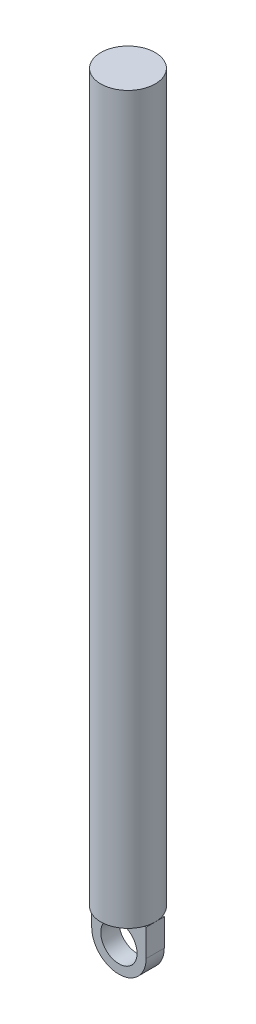
ISO-10303-21;
HEADER;
FILE_DESCRIPTION(('STEP AP214'),'2;1');
FILE_NAME('part.step','',(''),(''),'','','');
FILE_SCHEMA(('AUTOMOTIVE_DESIGN { 1 0 10303 214 1 1 1 1 }'));
ENDSEC;
DATA;
#1=APPLICATION_CONTEXT('core data for automotive mechanical design processes');
#2=APPLICATION_PROTOCOL_DEFINITION('international standard','automotive_design',2000,#1);
#3=PRODUCT_CONTEXT('',#1,'mechanical');
#4=PRODUCT('Part','Part','',(#3));
#5=PRODUCT_RELATED_PRODUCT_CATEGORY('part','',(#4));
#6=PRODUCT_DEFINITION_FORMATION('','',#4);
#7=PRODUCT_DEFINITION_CONTEXT('part definition',#1,'design');
#8=PRODUCT_DEFINITION('design','',#6,#7);
#9=PRODUCT_DEFINITION_SHAPE('','',#8);
#10=(LENGTH_UNIT() NAMED_UNIT(*) SI_UNIT(.MILLI.,.METRE.));
#11=(NAMED_UNIT(*) PLANE_ANGLE_UNIT() SI_UNIT($,.RADIAN.));
#12=(NAMED_UNIT(*) SI_UNIT($,.STERADIAN.) SOLID_ANGLE_UNIT());
#13=UNCERTAINTY_MEASURE_WITH_UNIT(LENGTH_MEASURE(1.E-05),#10,'distance_accuracy_value','');
#14=(GEOMETRIC_REPRESENTATION_CONTEXT(3) GLOBAL_UNCERTAINTY_ASSIGNED_CONTEXT((#13)) GLOBAL_UNIT_ASSIGNED_CONTEXT((#10,
#11,#12)) REPRESENTATION_CONTEXT('',''));
#15=CARTESIAN_POINT('',(0.,0.,0.));
#16=DIRECTION('',(0.,0.,1.));
#17=DIRECTION('',(1.,0.,0.));
#18=AXIS2_PLACEMENT_3D('',#15,#16,#17);
#19=CARTESIAN_POINT('',(0.,0.,0.));
#20=DIRECTION('',(0.,1.,0.));
#21=DIRECTION('',(0.,0.,1.));
#22=AXIS2_PLACEMENT_3D('',#19,#20,#21);
#23=PLANE('',#22);
#24=DIRECTION('',(1.,0.,0.));
#25=VECTOR('',#24,1.);
#26=CARTESIAN_POINT('',(0.,0.,-0.25));
#27=LINE('',#26,#25);
#28=CARTESIAN_POINT('',(0.792893218813452,0.,-0.25));
#29=VERTEX_POINT('',#28);
#30=CARTESIAN_POINT('',(2.20710678118655,0.,-0.25));
#31=VERTEX_POINT('',#30);
#32=EDGE_CURVE('E44',#29,#31,#27,.T.);
#33=ORIENTED_EDGE('',*,*,#32,.F.);
#34=CARTESIAN_POINT('',(1.5,0.,0.));
#35=DIRECTION('',(0.,1.,0.));
#36=DIRECTION('',(0.,0.,1.));
#37=AXIS2_PLACEMENT_3D('',#34,#35,#36);
#38=CIRCLE('',#37,0.75);
#39=EDGE_CURVE('E159',#31,#29,#38,.T.);
#40=ORIENTED_EDGE('',*,*,#39,.F.);
#41=EDGE_LOOP('',(#33,#40));
#42=FACE_BOUND('',#41,.T.);
#43=ADVANCED_FACE('F35',(#42),#23,.F.);
#44=CARTESIAN_POINT('',(0.792893218813452,0.,0.25));
#45=VERTEX_POINT('',#44);
#46=CARTESIAN_POINT('',(2.20710678118655,0.,0.25));
#47=VERTEX_POINT('',#46);
#48=EDGE_CURVE('E52',#45,#47,#38,.T.);
#49=ORIENTED_EDGE('',*,*,#48,.F.);
#50=DIRECTION('',(1.,0.,0.));
#51=VECTOR('',#50,1.);
#52=CARTESIAN_POINT('',(0.,0.,0.25));
#53=LINE('',#52,#51);
#54=EDGE_CURVE('E11',#45,#47,#53,.T.);
#55=ORIENTED_EDGE('',*,*,#54,.T.);
#56=EDGE_LOOP('',(#49,#55));
#57=FACE_BOUND('',#56,.T.);
#58=ADVANCED_FACE('F37',(#57),#23,.F.);
#59=CARTESIAN_POINT('',(1.5,20.,0.));
#60=DIRECTION('',(0.,1.,0.));
#61=DIRECTION('',(0.,0.,1.));
#62=AXIS2_PLACEMENT_3D('',#59,#60,#61);
#63=CYLINDRICAL_SURFACE('',#62,0.75);
#64=CARTESIAN_POINT('',(1.5,20.,0.));
#65=DIRECTION('',(0.,1.,0.));
#66=DIRECTION('',(0.,0.,1.));
#67=AXIS2_PLACEMENT_3D('',#64,#65,#66);
#68=CIRCLE('',#67,0.75);
#69=CARTESIAN_POINT('',(1.5,20.,0.75));
#70=VERTEX_POINT('',#69);
#71=EDGE_CURVE('E145',#70,#70,#68,.T.);
#72=ORIENTED_EDGE('',*,*,#71,.F.);
#73=EDGE_LOOP('',(#72));
#74=FACE_BOUND('',#73,.T.);
#75=CARTESIAN_POINT('',(2.25,0.,0.));
#76=VERTEX_POINT('',#75);
#77=EDGE_CURVE('E39',#47,#76,#38,.T.);
#78=ORIENTED_EDGE('',*,*,#77,.T.);
#79=EDGE_CURVE('E156',#76,#31,#38,.T.);
#80=ORIENTED_EDGE('',*,*,#79,.T.);
#81=ORIENTED_EDGE('',*,*,#39,.T.);
#82=CARTESIAN_POINT('',(0.75,0.,0.));
#83=VERTEX_POINT('',#82);
#84=EDGE_CURVE('E59',#29,#83,#38,.T.);
#85=ORIENTED_EDGE('',*,*,#84,.T.);
#86=EDGE_CURVE('E154',#83,#45,#38,.T.);
#87=ORIENTED_EDGE('',*,*,#86,.T.);
#88=ORIENTED_EDGE('',*,*,#48,.T.);
#89=EDGE_LOOP('',(#78,#80,#81,#85,#87,#88));
#90=FACE_BOUND('',#89,.T.);
#91=ADVANCED_FACE('F161',(#74,#90),#63,.T.);
#92=CARTESIAN_POINT('',(0.,20.,0.));
#93=DIRECTION('',(0.,1.,0.));
#94=DIRECTION('',(0.,0.,1.));
#95=AXIS2_PLACEMENT_3D('',#92,#93,#94);
#96=PLANE('',#95);
#97=ORIENTED_EDGE('',*,*,#71,.T.);
#98=EDGE_LOOP('',(#97));
#99=FACE_BOUND('',#98,.T.);
#100=ADVANCED_FACE('F187',(#99),#96,.T.);
#101=CARTESIAN_POINT('',(0.,0.,-0.25));
#102=DIRECTION('',(0.,-1.,0.));
#103=DIRECTION('',(0.,0.,-1.));
#104=AXIS2_PLACEMENT_3D('',#101,#102,#103);
#105=PLANE('',#104);
#106=ORIENTED_EDGE('',*,*,#77,.F.);
#107=CARTESIAN_POINT('',(2.25,0.,0.25));
#108=VERTEX_POINT('',#107);
#109=EDGE_CURVE('E47',#47,#108,#53,.T.);
#110=ORIENTED_EDGE('',*,*,#109,.T.);
#111=DIRECTION('',(0.,0.,1.));
#112=VECTOR('',#111,1.);
#113=CARTESIAN_POINT('',(2.25,0.,-0.25));
#114=LINE('',#113,#112);
#115=EDGE_CURVE('E150',#76,#108,#114,.T.);
#116=ORIENTED_EDGE('',*,*,#115,.F.);
#117=EDGE_LOOP('',(#106,#110,#116));
#118=FACE_BOUND('',#117,.T.);
#119=ADVANCED_FACE('F177',(#118),#105,.F.);
#120=ORIENTED_EDGE('',*,*,#79,.F.);
#121=CARTESIAN_POINT('',(2.25,0.,-0.25));
#122=VERTEX_POINT('',#121);
#123=EDGE_CURVE('E147',#122,#76,#114,.T.);
#124=ORIENTED_EDGE('',*,*,#123,.F.);
#125=EDGE_CURVE('E139',#31,#122,#27,.T.);
#126=ORIENTED_EDGE('',*,*,#125,.F.);
#127=EDGE_LOOP('',(#120,#124,#126));
#128=FACE_BOUND('',#127,.T.);
#129=ADVANCED_FACE('F179',(#128),#105,.F.);
#130=ORIENTED_EDGE('',*,*,#84,.F.);
#131=CARTESIAN_POINT('',(0.75,0.,-0.25));
#132=VERTEX_POINT('',#131);
#133=EDGE_CURVE('E111',#132,#29,#27,.T.);
#134=ORIENTED_EDGE('',*,*,#133,.F.);
#135=DIRECTION('',(0.,0.,1.));
#136=VECTOR('',#135,1.);
#137=CARTESIAN_POINT('',(0.75,0.,-0.25));
#138=LINE('',#137,#136);
#139=EDGE_CURVE('E142',#132,#83,#138,.T.);
#140=ORIENTED_EDGE('',*,*,#139,.T.);
#141=EDGE_LOOP('',(#130,#134,#140));
#142=FACE_BOUND('',#141,.T.);
#143=ADVANCED_FACE('F166',(#142),#105,.F.);
#144=CARTESIAN_POINT('',(0.75,0.,-0.25));
#145=DIRECTION('',(-1.,0.,0.));
#146=DIRECTION('',(0.,0.,1.));
#147=AXIS2_PLACEMENT_3D('',#144,#145,#146);
#148=PLANE('',#147);
#149=DIRECTION('',(0.,0.,1.));
#150=VECTOR('',#149,1.);
#151=CARTESIAN_POINT('',(0.75,-0.75,-0.25));
#152=LINE('',#151,#150);
#153=CARTESIAN_POINT('',(0.75,-0.75,-0.25));
#154=VERTEX_POINT('',#153);
#155=CARTESIAN_POINT('',(0.75,-0.75,0.25));
#156=VERTEX_POINT('',#155);
#157=EDGE_CURVE('E98',#154,#156,#152,.T.);
#158=ORIENTED_EDGE('',*,*,#157,.T.);
#159=DIRECTION('',(0.,-1.,0.));
#160=VECTOR('',#159,1.);
#161=CARTESIAN_POINT('',(0.75,0.,0.25));
#162=LINE('',#161,#160);
#163=CARTESIAN_POINT('',(0.75,0.,0.25));
#164=VERTEX_POINT('',#163);
#165=EDGE_CURVE('E103',#164,#156,#162,.T.);
#166=ORIENTED_EDGE('',*,*,#165,.F.);
#167=EDGE_CURVE('E146',#83,#164,#138,.T.);
#168=ORIENTED_EDGE('',*,*,#167,.F.);
#169=ORIENTED_EDGE('',*,*,#139,.F.);
#170=DIRECTION('',(0.,-1.,0.));
#171=VECTOR('',#170,1.);
#172=CARTESIAN_POINT('',(0.75,0.,-0.25));
#173=LINE('',#172,#171);
#174=EDGE_CURVE('E106',#132,#154,#173,.T.);
#175=ORIENTED_EDGE('',*,*,#174,.T.);
#176=EDGE_LOOP('',(#158,#166,#168,#169,#175));
#177=FACE_BOUND('',#176,.T.);
#178=ADVANCED_FACE('F100',(#177),#148,.T.);
#179=ORIENTED_EDGE('',*,*,#86,.F.);
#180=ORIENTED_EDGE('',*,*,#167,.T.);
#181=EDGE_CURVE('E46',#164,#45,#53,.T.);
#182=ORIENTED_EDGE('',*,*,#181,.T.);
#183=EDGE_LOOP('',(#179,#180,#182));
#184=FACE_BOUND('',#183,.T.);
#185=ADVANCED_FACE('F186',(#184),#105,.F.);
#186=CARTESIAN_POINT('',(2.25,0.,-0.25));
#187=DIRECTION('',(-1.,0.,0.));
#188=DIRECTION('',(0.,0.,1.));
#189=AXIS2_PLACEMENT_3D('',#186,#187,#188);
#190=PLANE('',#189);
#191=ORIENTED_EDGE('',*,*,#123,.T.);
#192=ORIENTED_EDGE('',*,*,#115,.T.);
#193=DIRECTION('',(0.,-1.,0.));
#194=VECTOR('',#193,1.);
#195=CARTESIAN_POINT('',(2.25,0.,0.25));
#196=LINE('',#195,#194);
#197=CARTESIAN_POINT('',(2.25,-0.75,0.25));
#198=VERTEX_POINT('',#197);
#199=EDGE_CURVE('E120',#108,#198,#196,.T.);
#200=ORIENTED_EDGE('',*,*,#199,.T.);
#201=DIRECTION('',(0.,0.,1.));
#202=VECTOR('',#201,1.);
#203=CARTESIAN_POINT('',(2.25,-0.75,-0.25));
#204=LINE('',#203,#202);
#205=CARTESIAN_POINT('',(2.25,-0.75,-0.25));
#206=VERTEX_POINT('',#205);
#207=EDGE_CURVE('E110',#206,#198,#204,.T.);
#208=ORIENTED_EDGE('',*,*,#207,.F.);
#209=DIRECTION('',(0.,-1.,0.));
#210=VECTOR('',#209,1.);
#211=CARTESIAN_POINT('',(2.25,0.,-0.25));
#212=LINE('',#211,#210);
#213=EDGE_CURVE('E137',#122,#206,#212,.T.);
#214=ORIENTED_EDGE('',*,*,#213,.F.);
#215=EDGE_LOOP('',(#191,#192,#200,#208,#214));
#216=FACE_BOUND('',#215,.T.);
#217=ADVANCED_FACE('F172',(#216),#190,.F.);
#218=CARTESIAN_POINT('',(1.5,-0.75,-0.25));
#219=DIRECTION('',(0.,0.,1.));
#220=DIRECTION('',(1.,0.,0.));
#221=AXIS2_PLACEMENT_3D('',#218,#219,#220);
#222=CYLINDRICAL_SURFACE('',#221,0.5);
#223=CARTESIAN_POINT('',(1.5,-0.75,-0.25));
#224=DIRECTION('',(0.,0.,1.));
#225=DIRECTION('',(1.,0.,0.));
#226=AXIS2_PLACEMENT_3D('',#223,#224,#225);
#227=CIRCLE('',#226,0.5);
#228=CARTESIAN_POINT('',(2.,-0.75,-0.25));
#229=VERTEX_POINT('',#228);
#230=EDGE_CURVE('E131',#229,#229,#227,.T.);
#231=ORIENTED_EDGE('',*,*,#230,.F.);
#232=EDGE_LOOP('',(#231));
#233=FACE_BOUND('',#232,.T.);
#234=CARTESIAN_POINT('',(1.5,-0.75,0.25));
#235=DIRECTION('',(0.,0.,1.));
#236=DIRECTION('',(1.,0.,0.));
#237=AXIS2_PLACEMENT_3D('',#234,#235,#236);
#238=CIRCLE('',#237,0.5);
#239=CARTESIAN_POINT('',(2.,-0.75,0.25));
#240=VERTEX_POINT('',#239);
#241=EDGE_CURVE('E125',#240,#240,#238,.T.);
#242=ORIENTED_EDGE('',*,*,#241,.T.);
#243=EDGE_LOOP('',(#242));
#244=FACE_BOUND('',#243,.T.);
#245=ADVANCED_FACE('F203',(#233,#244),#222,.F.);
#246=CARTESIAN_POINT('',(1.5,-0.75,-0.25));
#247=DIRECTION('',(0.,0.,1.));
#248=DIRECTION('',(1.,0.,0.));
#249=AXIS2_PLACEMENT_3D('',#246,#247,#248);
#250=CYLINDRICAL_SURFACE('',#249,0.75);
#251=ORIENTED_EDGE('',*,*,#207,.T.);
#252=CARTESIAN_POINT('',(1.5,-0.75,0.25));
#253=DIRECTION('',(0.,0.,1.));
#254=DIRECTION('',(1.,0.,0.));
#255=AXIS2_PLACEMENT_3D('',#252,#253,#254);
#256=CIRCLE('',#255,0.75);
#257=EDGE_CURVE('E114',#156,#198,#256,.T.);
#258=ORIENTED_EDGE('',*,*,#257,.F.);
#259=ORIENTED_EDGE('',*,*,#157,.F.);
#260=CARTESIAN_POINT('',(1.5,-0.75,-0.25));
#261=DIRECTION('',(0.,0.,1.));
#262=DIRECTION('',(1.,0.,0.));
#263=AXIS2_PLACEMENT_3D('',#260,#261,#262);
#264=CIRCLE('',#263,0.75);
#265=EDGE_CURVE('E135',#154,#206,#264,.T.);
#266=ORIENTED_EDGE('',*,*,#265,.T.);
#267=EDGE_LOOP('',(#251,#258,#259,#266));
#268=FACE_BOUND('',#267,.T.);
#269=ADVANCED_FACE('F115',(#268),#250,.T.);
#270=CARTESIAN_POINT('',(0.,0.,-0.25));
#271=DIRECTION('',(0.,0.,1.));
#272=DIRECTION('',(1.,0.,0.));
#273=AXIS2_PLACEMENT_3D('',#270,#271,#272);
#274=PLANE('',#273);
#275=ORIENTED_EDGE('',*,*,#230,.T.);
#276=EDGE_LOOP('',(#275));
#277=FACE_BOUND('',#276,.T.);
#278=ORIENTED_EDGE('',*,*,#174,.F.);
#279=ORIENTED_EDGE('',*,*,#133,.T.);
#280=ORIENTED_EDGE('',*,*,#32,.T.);
#281=ORIENTED_EDGE('',*,*,#125,.T.);
#282=ORIENTED_EDGE('',*,*,#213,.T.);
#283=ORIENTED_EDGE('',*,*,#265,.F.);
#284=EDGE_LOOP('',(#278,#279,#280,#281,#282,#283));
#285=FACE_BOUND('',#284,.T.);
#286=ADVANCED_FACE('F168',(#277,#285),#274,.F.);
#287=CARTESIAN_POINT('',(0.,0.,0.25));
#288=DIRECTION('',(0.,0.,1.));
#289=DIRECTION('',(1.,0.,0.));
#290=AXIS2_PLACEMENT_3D('',#287,#288,#289);
#291=PLANE('',#290);
#292=ORIENTED_EDGE('',*,*,#241,.F.);
#293=EDGE_LOOP('',(#292));
#294=FACE_BOUND('',#293,.T.);
#295=ORIENTED_EDGE('',*,*,#165,.T.);
#296=ORIENTED_EDGE('',*,*,#257,.T.);
#297=ORIENTED_EDGE('',*,*,#199,.F.);
#298=ORIENTED_EDGE('',*,*,#109,.F.);
#299=ORIENTED_EDGE('',*,*,#54,.F.);
#300=ORIENTED_EDGE('',*,*,#181,.F.);
#301=EDGE_LOOP('',(#295,#296,#297,#298,#299,#300));
#302=FACE_BOUND('',#301,.T.);
#303=ADVANCED_FACE('F122',(#294,#302),#291,.T.);
#304=CLOSED_SHELL('',(#43,#58,#91,#100,#119,#129,#143,#178,#185,#217,#245,#269,#286,#303));
#305=MANIFOLD_SOLID_BREP('B2',#304);
#306=ADVANCED_BREP_SHAPE_REPRESENTATION('',(#18,#305),#14);
#307=SHAPE_DEFINITION_REPRESENTATION(#9,#306);
ENDSEC;
END-ISO-10303-21;
